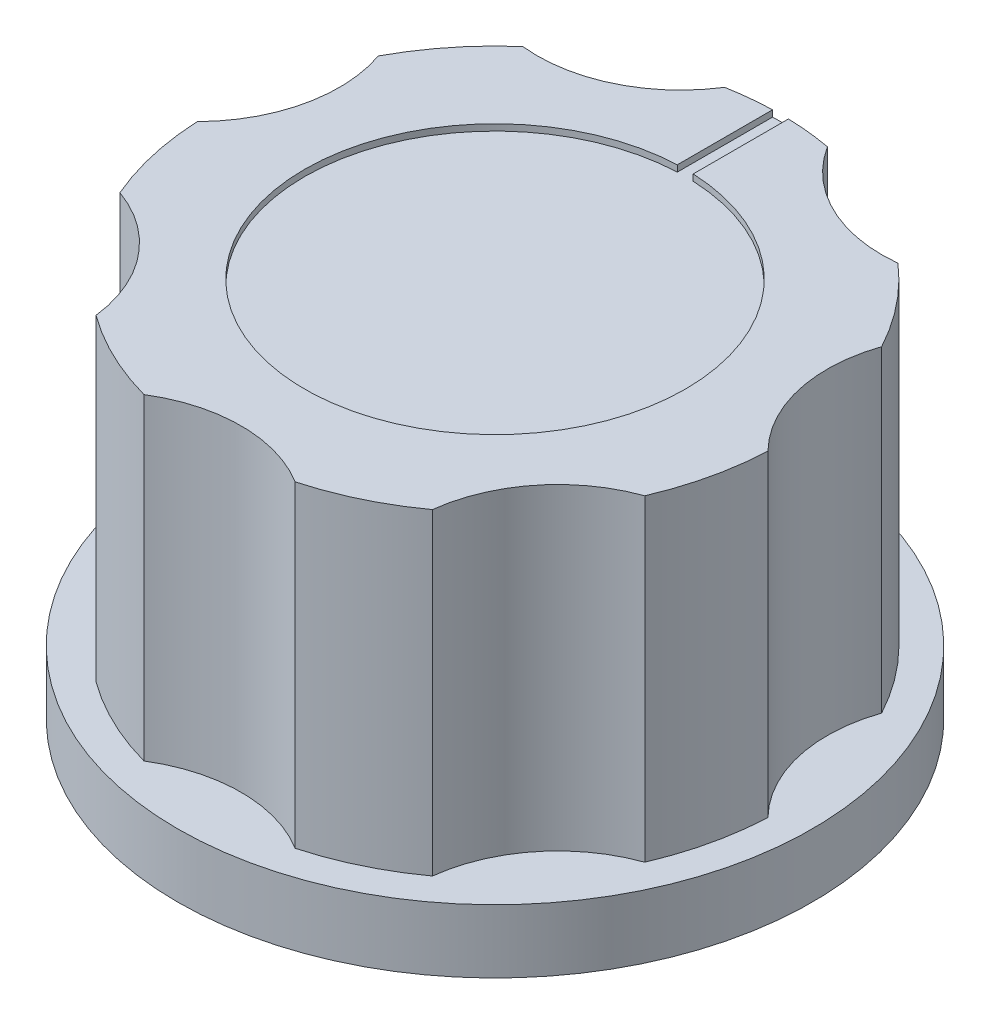
ISO-10303-21;
HEADER;
FILE_DESCRIPTION(('STEP AP214'),'2;1');
FILE_NAME('part.step','',(''),(''),'','','');
FILE_SCHEMA(('AUTOMOTIVE_DESIGN { 1 0 10303 214 1 1 1 1 }'));
ENDSEC;
DATA;
#1=APPLICATION_CONTEXT('core data for automotive mechanical design processes');
#2=APPLICATION_PROTOCOL_DEFINITION('international standard','automotive_design',2000,#1);
#3=PRODUCT_CONTEXT('',#1,'mechanical');
#4=PRODUCT('Part','Part','',(#3));
#5=PRODUCT_RELATED_PRODUCT_CATEGORY('part','',(#4));
#6=PRODUCT_DEFINITION_FORMATION('','',#4);
#7=PRODUCT_DEFINITION_CONTEXT('part definition',#1,'design');
#8=PRODUCT_DEFINITION('design','',#6,#7);
#9=PRODUCT_DEFINITION_SHAPE('','',#8);
#10=(LENGTH_UNIT() NAMED_UNIT(*) SI_UNIT(.MILLI.,.METRE.));
#11=(NAMED_UNIT(*) PLANE_ANGLE_UNIT() SI_UNIT($,.RADIAN.));
#12=(NAMED_UNIT(*) SI_UNIT($,.STERADIAN.) SOLID_ANGLE_UNIT());
#13=UNCERTAINTY_MEASURE_WITH_UNIT(LENGTH_MEASURE(1.E-05),#10,'distance_accuracy_value','');
#14=(GEOMETRIC_REPRESENTATION_CONTEXT(3) GLOBAL_UNCERTAINTY_ASSIGNED_CONTEXT((#13)) GLOBAL_UNIT_ASSIGNED_CONTEXT((#10,
#11,#12)) REPRESENTATION_CONTEXT('',''));
#15=CARTESIAN_POINT('',(0.,0.,0.));
#16=DIRECTION('',(0.,0.,1.));
#17=DIRECTION('',(1.,0.,0.));
#18=AXIS2_PLACEMENT_3D('',#15,#16,#17);
#19=CARTESIAN_POINT('',(0.,11.8,0.));
#20=DIRECTION('',(0.,1.,0.));
#21=DIRECTION('',(0.,0.,1.));
#22=AXIS2_PLACEMENT_3D('',#19,#20,#21);
#23=PLANE('',#22);
#24=CARTESIAN_POINT('',(0.,11.8,0.));
#25=DIRECTION('',(0.,-1.,0.));
#26=DIRECTION('',(0.,0.,-1.));
#27=AXIS2_PLACEMENT_3D('',#24,#25,#26);
#28=CIRCLE('',#27,9.);
#29=CARTESIAN_POINT('',(0.249999999999999,11.8,-8.99652710772329));
#30=VERTEX_POINT('',#29);
#31=CARTESIAN_POINT('',(-0.25,11.8,-8.99652710772329));
#32=VERTEX_POINT('',#31);
#33=EDGE_CURVE('E18',#30,#32,#28,.F.);
#34=ORIENTED_EDGE('',*,*,#33,.T.);
#35=DIRECTION('',(0.,0.,-1.));
#36=VECTOR('',#35,1.);
#37=CARTESIAN_POINT('',(-0.250000000000001,11.8,-5.));
#38=LINE('',#37,#36);
#39=CARTESIAN_POINT('',(-0.250000000000001,11.8,-5.9947894041409));
#40=VERTEX_POINT('',#39);
#41=EDGE_CURVE('E157',#40,#32,#38,.T.);
#42=ORIENTED_EDGE('',*,*,#41,.F.);
#43=CARTESIAN_POINT('',(0.,11.8,0.));
#44=DIRECTION('',(0.,1.,0.));
#45=DIRECTION('',(0.,0.,1.));
#46=AXIS2_PLACEMENT_3D('',#43,#44,#45);
#47=CIRCLE('',#46,6.);
#48=CARTESIAN_POINT('',(0.25,11.8,-5.9947894041409));
#49=VERTEX_POINT('',#48);
#50=EDGE_CURVE('E152',#40,#49,#47,.T.);
#51=ORIENTED_EDGE('',*,*,#50,.T.);
#52=DIRECTION('',(0.,0.,-1.));
#53=VECTOR('',#52,1.);
#54=CARTESIAN_POINT('',(0.249999999999999,11.8,-5.));
#55=LINE('',#54,#53);
#56=EDGE_CURVE('E151',#49,#30,#55,.T.);
#57=ORIENTED_EDGE('',*,*,#56,.T.);
#58=EDGE_LOOP('',(#34,#42,#51,#57));
#59=FACE_BOUND('',#58,.T.);
#60=ADVANCED_FACE('F15',(#59),#23,.T.);
#61=CARTESIAN_POINT('',(-0.250000000000001,6.77506218943955,-5.));
#62=DIRECTION('',(1.,0.,0.));
#63=DIRECTION('',(0.,0.,-1.));
#64=AXIS2_PLACEMENT_3D('',#61,#62,#63);
#65=PLANE('',#64);
#66=DIRECTION('',(0.,1.,0.));
#67=VECTOR('',#66,1.);
#68=CARTESIAN_POINT('',(-0.250000000000001,6.77506218943955,-5.9947894041409));
#69=LINE('',#68,#67);
#70=CARTESIAN_POINT('',(-0.250000000000001,12.,-5.9947894041409));
#71=VERTEX_POINT('',#70);
#72=EDGE_CURVE('E149',#71,#40,#69,.F.);
#73=ORIENTED_EDGE('',*,*,#72,.T.);
#74=ORIENTED_EDGE('',*,*,#41,.T.);
#75=DIRECTION('',(0.,-1.,0.));
#76=VECTOR('',#75,1.);
#77=CARTESIAN_POINT('',(-0.25,12.,-8.99652710772329));
#78=LINE('',#77,#76);
#79=CARTESIAN_POINT('',(-0.25,12.,-8.99652710772329));
#80=VERTEX_POINT('',#79);
#81=EDGE_CURVE('E148',#80,#32,#78,.T.);
#82=ORIENTED_EDGE('',*,*,#81,.F.);
#83=DIRECTION('',(0.,0.,1.));
#84=VECTOR('',#83,1.);
#85=CARTESIAN_POINT('',(-0.250000000000001,12.,0.));
#86=LINE('',#85,#84);
#87=EDGE_CURVE('E164',#71,#80,#86,.F.);
#88=ORIENTED_EDGE('',*,*,#87,.F.);
#89=EDGE_LOOP('',(#73,#74,#82,#88));
#90=FACE_BOUND('',#89,.T.);
#91=ADVANCED_FACE('F414',(#90),#65,.T.);
#92=CARTESIAN_POINT('',(0.249999999999999,6.77506218943955,-5.));
#93=DIRECTION('',(1.,0.,0.));
#94=DIRECTION('',(0.,0.,-1.));
#95=AXIS2_PLACEMENT_3D('',#92,#93,#94);
#96=PLANE('',#95);
#97=DIRECTION('',(0.,1.,0.));
#98=VECTOR('',#97,1.);
#99=CARTESIAN_POINT('',(0.25,11.8,-5.9947894041409));
#100=LINE('',#99,#98);
#101=CARTESIAN_POINT('',(0.25,12.,-5.9947894041409));
#102=VERTEX_POINT('',#101);
#103=EDGE_CURVE('E156',#49,#102,#100,.T.);
#104=ORIENTED_EDGE('',*,*,#103,.T.);
#105=DIRECTION('',(0.,0.,1.));
#106=VECTOR('',#105,1.);
#107=CARTESIAN_POINT('',(0.249999999999999,12.,0.));
#108=LINE('',#107,#106);
#109=CARTESIAN_POINT('',(0.249999999999999,12.,-8.99652710772329));
#110=VERTEX_POINT('',#109);
#111=EDGE_CURVE('E161',#110,#102,#108,.T.);
#112=ORIENTED_EDGE('',*,*,#111,.F.);
#113=DIRECTION('',(0.,-1.,0.));
#114=VECTOR('',#113,1.);
#115=CARTESIAN_POINT('',(0.249999999999999,12.,-8.99652710772329));
#116=LINE('',#115,#114);
#117=EDGE_CURVE('E144',#30,#110,#116,.F.);
#118=ORIENTED_EDGE('',*,*,#117,.F.);
#119=ORIENTED_EDGE('',*,*,#56,.F.);
#120=EDGE_LOOP('',(#104,#112,#118,#119));
#121=FACE_BOUND('',#120,.T.);
#122=ADVANCED_FACE('F160',(#121),#96,.F.);
#123=CARTESIAN_POINT('',(0.,11.8,0.));
#124=DIRECTION('',(0.,1.,0.));
#125=DIRECTION('',(0.,0.,1.));
#126=AXIS2_PLACEMENT_3D('',#123,#124,#125);
#127=CYLINDRICAL_SURFACE('',#126,6.);
#128=ORIENTED_EDGE('',*,*,#50,.F.);
#129=ORIENTED_EDGE('',*,*,#72,.F.);
#130=CARTESIAN_POINT('',(0.,12.,0.));
#131=DIRECTION('',(0.,1.,0.));
#132=DIRECTION('',(0.,0.,1.));
#133=AXIS2_PLACEMENT_3D('',#130,#131,#132);
#134=CIRCLE('',#133,6.);
#135=EDGE_CURVE('E260',#102,#71,#134,.F.);
#136=ORIENTED_EDGE('',*,*,#135,.F.);
#137=ORIENTED_EDGE('',*,*,#103,.F.);
#138=EDGE_LOOP('',(#128,#129,#136,#137));
#139=FACE_BOUND('',#138,.T.);
#140=ADVANCED_FACE('F268',(#139),#127,.F.);
#141=CARTESIAN_POINT('',(0.,11.,0.));
#142=DIRECTION('',(0.,-1.,0.));
#143=DIRECTION('',(0.,0.,-1.));
#144=AXIS2_PLACEMENT_3D('',#141,#142,#143);
#145=PLANE('',#144);
#146=CARTESIAN_POINT('',(0.,11.,0.));
#147=DIRECTION('',(0.,-1.,0.));
#148=DIRECTION('',(0.,0.,-1.));
#149=AXIS2_PLACEMENT_3D('',#146,#147,#148);
#150=CIRCLE('',#149,3.5);
#151=CARTESIAN_POINT('',(0.,11.,-3.5));
#152=VERTEX_POINT('',#151);
#153=EDGE_CURVE('E257',#152,#152,#150,.T.);
#154=ORIENTED_EDGE('',*,*,#153,.T.);
#155=EDGE_LOOP('',(#154));
#156=FACE_BOUND('',#155,.T.);
#157=ADVANCED_FACE('F402',(#156),#145,.T.);
#158=CARTESIAN_POINT('',(0.,12.,0.));
#159=DIRECTION('',(0.,-1.,0.));
#160=DIRECTION('',(0.,0.,-1.));
#161=AXIS2_PLACEMENT_3D('',#158,#159,#160);
#162=CYLINDRICAL_SURFACE('',#161,9.);
#163=DIRECTION('',(0.,-1.,0.));
#164=VECTOR('',#163,1.);
#165=CARTESIAN_POINT('',(1.6221993050285,12.,-8.85259676110716));
#166=LINE('',#165,#164);
#167=CARTESIAN_POINT('',(1.6221993050285,12.,-8.85259676110716));
#168=VERTEX_POINT('',#167);
#169=CARTESIAN_POINT('',(1.6221993050285,2.,-8.85259676110716));
#170=VERTEX_POINT('',#169);
#171=EDGE_CURVE('E232',#168,#170,#166,.T.);
#172=ORIENTED_EDGE('',*,*,#171,.T.);
#173=CARTESIAN_POINT('',(0.,2.,0.));
#174=DIRECTION('',(0.,-1.,0.));
#175=DIRECTION('',(0.,0.,-1.));
#176=AXIS2_PLACEMENT_3D('',#173,#174,#175);
#177=CIRCLE('',#176,9.);
#178=CARTESIAN_POINT('',(-1.61852102637475,2.,-8.85326999967711));
#179=VERTEX_POINT('',#178);
#180=EDGE_CURVE('E162',#170,#179,#177,.F.);
#181=ORIENTED_EDGE('',*,*,#180,.T.);
#182=DIRECTION('',(0.,-1.,0.));
#183=VECTOR('',#182,1.);
#184=CARTESIAN_POINT('',(-1.61852102637475,12.,-8.85326999967711));
#185=LINE('',#184,#183);
#186=CARTESIAN_POINT('',(-1.61852102637475,12.,-8.85326999967711));
#187=VERTEX_POINT('',#186);
#188=EDGE_CURVE('E237',#179,#187,#185,.F.);
#189=ORIENTED_EDGE('',*,*,#188,.T.);
#190=CARTESIAN_POINT('',(0.,12.,0.));
#191=DIRECTION('',(0.,-1.,0.));
#192=DIRECTION('',(0.,0.,-1.));
#193=AXIS2_PLACEMENT_3D('',#190,#191,#192);
#194=CIRCLE('',#193,9.);
#195=EDGE_CURVE('E264',#80,#187,#194,.F.);
#196=ORIENTED_EDGE('',*,*,#195,.F.);
#197=ORIENTED_EDGE('',*,*,#81,.T.);
#198=ORIENTED_EDGE('',*,*,#33,.F.);
#199=ORIENTED_EDGE('',*,*,#117,.T.);
#200=CARTESIAN_POINT('',(0.,12.,0.));
#201=DIRECTION('',(0.,-1.,0.));
#202=DIRECTION('',(0.,0.,-1.));
#203=AXIS2_PLACEMENT_3D('',#200,#201,#202);
#204=CIRCLE('',#203,9.);
#205=EDGE_CURVE('E262',#168,#110,#204,.F.);
#206=ORIENTED_EDGE('',*,*,#205,.F.);
#207=EDGE_LOOP('',(#172,#181,#189,#196,#197,#198,#199,#206));
#208=FACE_BOUND('',#207,.T.);
#209=ADVANCED_FACE('F142',(#208),#162,.T.);
#210=CARTESIAN_POINT('',(0.,12.,0.));
#211=DIRECTION('',(0.,1.,0.));
#212=DIRECTION('',(0.,0.,1.));
#213=AXIS2_PLACEMENT_3D('',#210,#211,#212);
#214=PLANE('',#213);
#215=ORIENTED_EDGE('',*,*,#111,.T.);
#216=ORIENTED_EDGE('',*,*,#135,.T.);
#217=ORIENTED_EDGE('',*,*,#87,.T.);
#218=ORIENTED_EDGE('',*,*,#195,.T.);
#219=CARTESIAN_POINT('',(-5.42751087701987,12.,-11.2747237525284));
#220=DIRECTION('',(0.,-1.,0.));
#221=DIRECTION('',(0.,0.,-1.));
#222=AXIS2_PLACEMENT_3D('',#219,#220,#221);
#223=CIRCLE('',#222,4.51351769238971);
#224=CARTESIAN_POINT('',(-5.91057194608461,12.,-6.78713041499555));
#225=VERTEX_POINT('',#224);
#226=EDGE_CURVE('E234',#187,#225,#223,.T.);
#227=ORIENTED_EDGE('',*,*,#226,.T.);
#228=CARTESIAN_POINT('',(0.,12.,0.));
#229=DIRECTION('',(0.,-1.,0.));
#230=DIRECTION('',(0.,0.,-1.));
#231=AXIS2_PLACEMENT_3D('',#228,#229,#230);
#232=CIRCLE('',#231,9.);
#233=CARTESIAN_POINT('',(-7.93083109619143,12.,-4.25463489898757));
#234=VERTEX_POINT('',#233);
#235=EDGE_CURVE('E238',#234,#225,#232,.T.);
#236=ORIENTED_EDGE('',*,*,#235,.F.);
#237=CARTESIAN_POINT('',(-12.1985551569579,12.,-2.7854945719016));
#238=DIRECTION('',(0.,-1.,0.));
#239=DIRECTION('',(0.,0.,-1.));
#240=AXIS2_PLACEMENT_3D('',#237,#238,#239);
#241=CIRCLE('',#240,4.51351769238971);
#242=CARTESIAN_POINT('',(-8.99152528670805,12.,0.390477935983253));
#243=VERTEX_POINT('',#242);
#244=EDGE_CURVE('E241',#234,#243,#241,.T.);
#245=ORIENTED_EDGE('',*,*,#244,.T.);
#246=CARTESIAN_POINT('',(0.,12.,0.));
#247=DIRECTION('',(0.,-1.,0.));
#248=DIRECTION('',(0.,0.,-1.));
#249=AXIS2_PLACEMENT_3D('',#246,#247,#248);
#250=CIRCLE('',#249,9.);
#251=CARTESIAN_POINT('',(-8.27087181721517,12.,3.5486165449645));
#252=VERTEX_POINT('',#251);
#253=EDGE_CURVE('E245',#252,#243,#250,.T.);
#254=ORIENTED_EDGE('',*,*,#253,.F.);
#255=CARTESIAN_POINT('',(-9.78308557813283,12.,7.80126883510135));
#256=DIRECTION('',(0.,-1.,0.));
#257=DIRECTION('',(0.,0.,-1.));
#258=AXIS2_PLACEMENT_3D('',#255,#256,#257);
#259=CIRCLE('',#258,4.51351769238971);
#260=CARTESIAN_POINT('',(-5.30052517444999,12.,7.27354335073504));
#261=VERTEX_POINT('',#260);
#262=EDGE_CURVE('E248',#252,#261,#259,.T.);
#263=ORIENTED_EDGE('',*,*,#262,.T.);
#264=CARTESIAN_POINT('',(0.,12.,0.));
#265=DIRECTION('',(0.,-1.,0.));
#266=DIRECTION('',(0.,0.,-1.));
#267=AXIS2_PLACEMENT_3D('',#264,#265,#266);
#268=CIRCLE('',#267,9.);
#269=CARTESIAN_POINT('',(-2.38125,12.,8.67926543190724));
#270=VERTEX_POINT('',#269);
#271=EDGE_CURVE('E252',#270,#261,#268,.T.);
#272=ORIENTED_EDGE('',*,*,#271,.F.);
#273=CARTESIAN_POINT('',(0.,12.,12.5135176923897));
#274=DIRECTION('',(0.,-1.,0.));
#275=DIRECTION('',(0.,0.,-1.));
#276=AXIS2_PLACEMENT_3D('',#273,#274,#275);
#277=CIRCLE('',#276,4.51351769238971);
#278=CARTESIAN_POINT('',(2.38125,12.,8.67926543190724));
#279=VERTEX_POINT('',#278);
#280=EDGE_CURVE('E255',#270,#279,#277,.T.);
#281=ORIENTED_EDGE('',*,*,#280,.T.);
#282=CARTESIAN_POINT('',(0.,12.,0.));
#283=DIRECTION('',(0.,-1.,0.));
#284=DIRECTION('',(0.,0.,-1.));
#285=AXIS2_PLACEMENT_3D('',#282,#283,#284);
#286=CIRCLE('',#285,9.);
#287=CARTESIAN_POINT('',(5.30155090057745,12.,7.27279575188156));
#288=VERTEX_POINT('',#287);
#289=EDGE_CURVE('E211',#288,#279,#286,.T.);
#290=ORIENTED_EDGE('',*,*,#289,.F.);
#291=CARTESIAN_POINT('',(9.78383859852912,12.,7.80283249806629));
#292=DIRECTION('',(0.,-1.,0.));
#293=DIRECTION('',(0.,0.,-1.));
#294=AXIS2_PLACEMENT_3D('',#291,#292,#293);
#295=CIRCLE('',#294,4.51351769238971);
#296=CARTESIAN_POINT('',(8.26994399063393,12.,3.55077827972654));
#297=VERTEX_POINT('',#296);
#298=EDGE_CURVE('E215',#288,#297,#295,.T.);
#299=ORIENTED_EDGE('',*,*,#298,.T.);
#300=CARTESIAN_POINT('',(0.,12.,0.));
#301=DIRECTION('',(0.,-1.,0.));
#302=DIRECTION('',(0.,0.,-1.));
#303=AXIS2_PLACEMENT_3D('',#300,#301,#302);
#304=CIRCLE('',#303,9.);
#305=CARTESIAN_POINT('',(8.99154694707646,12.,0.389978843682589));
#306=VERTEX_POINT('',#305);
#307=EDGE_CURVE('E219',#306,#297,#304,.T.);
#308=ORIENTED_EDGE('',*,*,#307,.F.);
#309=CARTESIAN_POINT('',(12.2010001988258,12.,-2.78354471607724));
#310=DIRECTION('',(0.,-1.,0.));
#311=DIRECTION('',(0.,0.,-1.));
#312=AXIS2_PLACEMENT_3D('',#309,#310,#311);
#313=CIRCLE('',#312,4.51351769238971);
#314=CARTESIAN_POINT('',(7.93272911158021,12.,-4.25109501685012));
#315=VERTEX_POINT('',#314);
#316=EDGE_CURVE('E222',#306,#315,#313,.T.);
#317=ORIENTED_EDGE('',*,*,#316,.T.);
#318=CARTESIAN_POINT('',(0.,12.,0.));
#319=DIRECTION('',(0.,-1.,0.));
#320=DIRECTION('',(0.,0.,-1.));
#321=AXIS2_PLACEMENT_3D('',#318,#319,#320);
#322=CIRCLE('',#321,9.);
#323=CARTESIAN_POINT('',(5.91187609212745,12.,-6.78599447917045));
#324=VERTEX_POINT('',#323);
#325=EDGE_CURVE('E226',#324,#315,#322,.T.);
#326=ORIENTED_EDGE('',*,*,#325,.F.);
#327=CARTESIAN_POINT('',(5.43131281475566,12.,-11.2738559850501));
#328=DIRECTION('',(0.,-1.,0.));
#329=DIRECTION('',(0.,0.,-1.));
#330=AXIS2_PLACEMENT_3D('',#327,#328,#329);
#331=CIRCLE('',#330,4.51351769238971);
#332=EDGE_CURVE('E229',#324,#168,#331,.T.);
#333=ORIENTED_EDGE('',*,*,#332,.T.);
#334=ORIENTED_EDGE('',*,*,#205,.T.);
#335=EDGE_LOOP('',(#215,#216,#217,#218,#227,#236,#245,#254,#263,#272,#281,#290,#299,#308,#317,
#326,#333,#334));
#336=FACE_BOUND('',#335,.T.);
#337=ADVANCED_FACE('F271',(#336),#214,.T.);
#338=CARTESIAN_POINT('',(0.,11.,0.));
#339=DIRECTION('',(0.,-1.,0.));
#340=DIRECTION('',(0.,0.,-1.));
#341=AXIS2_PLACEMENT_3D('',#338,#339,#340);
#342=CYLINDRICAL_SURFACE('',#341,3.5);
#343=CARTESIAN_POINT('',(0.,2.,0.));
#344=DIRECTION('',(0.,-1.,0.));
#345=DIRECTION('',(0.,0.,-1.));
#346=AXIS2_PLACEMENT_3D('',#343,#344,#345);
#347=CIRCLE('',#346,3.5);
#348=CARTESIAN_POINT('',(0.,2.,-3.5));
#349=VERTEX_POINT('',#348);
#350=EDGE_CURVE('E207',#349,#349,#347,.F.);
#351=ORIENTED_EDGE('',*,*,#350,.F.);
#352=EDGE_LOOP('',(#351));
#353=FACE_BOUND('',#352,.T.);
#354=ORIENTED_EDGE('',*,*,#153,.F.);
#355=EDGE_LOOP('',(#354));
#356=FACE_BOUND('',#355,.T.);
#357=ADVANCED_FACE('F396',(#353,#356),#342,.F.);
#358=CARTESIAN_POINT('',(0.,12.,12.5135176923897));
#359=DIRECTION('',(0.,-1.,0.));
#360=DIRECTION('',(0.,0.,-1.));
#361=AXIS2_PLACEMENT_3D('',#358,#359,#360);
#362=CYLINDRICAL_SURFACE('',#361,4.51351769238971);
#363=ORIENTED_EDGE('',*,*,#280,.F.);
#364=DIRECTION('',(0.,-1.,0.));
#365=VECTOR('',#364,1.);
#366=CARTESIAN_POINT('',(-2.38125,12.,8.67926543190724));
#367=LINE('',#366,#365);
#368=CARTESIAN_POINT('',(-2.38125,2.,8.67926543190724));
#369=VERTEX_POINT('',#368);
#370=EDGE_CURVE('E254',#369,#270,#367,.F.);
#371=ORIENTED_EDGE('',*,*,#370,.F.);
#372=CARTESIAN_POINT('',(0.,2.,12.5135176923897));
#373=DIRECTION('',(0.,-1.,0.));
#374=DIRECTION('',(0.,0.,-1.));
#375=AXIS2_PLACEMENT_3D('',#372,#373,#374);
#376=CIRCLE('',#375,4.51351769238971);
#377=CARTESIAN_POINT('',(2.38125,2.,8.67926543190724));
#378=VERTEX_POINT('',#377);
#379=EDGE_CURVE('E205',#378,#369,#376,.F.);
#380=ORIENTED_EDGE('',*,*,#379,.F.);
#381=DIRECTION('',(0.,-1.,0.));
#382=VECTOR('',#381,1.);
#383=CARTESIAN_POINT('',(2.38125,12.,8.67926543190724));
#384=LINE('',#383,#382);
#385=EDGE_CURVE('E210',#279,#378,#384,.T.);
#386=ORIENTED_EDGE('',*,*,#385,.F.);
#387=EDGE_LOOP('',(#363,#371,#380,#386));
#388=FACE_BOUND('',#387,.T.);
#389=ADVANCED_FACE('F309',(#388),#362,.F.);
#390=CARTESIAN_POINT('',(0.,12.,0.));
#391=DIRECTION('',(0.,-1.,0.));
#392=DIRECTION('',(0.,0.,-1.));
#393=AXIS2_PLACEMENT_3D('',#390,#391,#392);
#394=CYLINDRICAL_SURFACE('',#393,9.);
#395=ORIENTED_EDGE('',*,*,#271,.T.);
#396=DIRECTION('',(0.,-1.,0.));
#397=VECTOR('',#396,1.);
#398=CARTESIAN_POINT('',(-5.30052517444999,12.,7.27354335073504));
#399=LINE('',#398,#397);
#400=CARTESIAN_POINT('',(-5.30052517444999,2.,7.27354335073504));
#401=VERTEX_POINT('',#400);
#402=EDGE_CURVE('E251',#261,#401,#399,.T.);
#403=ORIENTED_EDGE('',*,*,#402,.T.);
#404=CARTESIAN_POINT('',(0.,2.,0.));
#405=DIRECTION('',(0.,-1.,0.));
#406=DIRECTION('',(0.,0.,-1.));
#407=AXIS2_PLACEMENT_3D('',#404,#405,#406);
#408=CIRCLE('',#407,9.);
#409=EDGE_CURVE('E203',#369,#401,#408,.T.);
#410=ORIENTED_EDGE('',*,*,#409,.F.);
#411=ORIENTED_EDGE('',*,*,#370,.T.);
#412=EDGE_LOOP('',(#395,#403,#410,#411));
#413=FACE_BOUND('',#412,.T.);
#414=ADVANCED_FACE('F312',(#413),#394,.T.);
#415=CARTESIAN_POINT('',(-9.78308557813283,12.,7.80126883510135));
#416=DIRECTION('',(0.,-1.,0.));
#417=DIRECTION('',(0.,0.,-1.));
#418=AXIS2_PLACEMENT_3D('',#415,#416,#417);
#419=CYLINDRICAL_SURFACE('',#418,4.51351769238971);
#420=ORIENTED_EDGE('',*,*,#402,.F.);
#421=ORIENTED_EDGE('',*,*,#262,.F.);
#422=DIRECTION('',(0.,-1.,0.));
#423=VECTOR('',#422,1.);
#424=CARTESIAN_POINT('',(-8.27087181721517,12.,3.5486165449645));
#425=LINE('',#424,#423);
#426=CARTESIAN_POINT('',(-8.27087181721517,2.,3.5486165449645));
#427=VERTEX_POINT('',#426);
#428=EDGE_CURVE('E247',#427,#252,#425,.F.);
#429=ORIENTED_EDGE('',*,*,#428,.F.);
#430=CARTESIAN_POINT('',(-9.78308557813283,2.,7.80126883510135));
#431=DIRECTION('',(0.,-1.,0.));
#432=DIRECTION('',(0.,0.,-1.));
#433=AXIS2_PLACEMENT_3D('',#430,#431,#432);
#434=CIRCLE('',#433,4.51351769238971);
#435=EDGE_CURVE('E201',#401,#427,#434,.F.);
#436=ORIENTED_EDGE('',*,*,#435,.F.);
#437=EDGE_LOOP('',(#420,#421,#429,#436));
#438=FACE_BOUND('',#437,.T.);
#439=ADVANCED_FACE('F317',(#438),#419,.F.);
#440=CARTESIAN_POINT('',(0.,12.,0.));
#441=DIRECTION('',(0.,-1.,0.));
#442=DIRECTION('',(0.,0.,-1.));
#443=AXIS2_PLACEMENT_3D('',#440,#441,#442);
#444=CYLINDRICAL_SURFACE('',#443,9.);
#445=ORIENTED_EDGE('',*,*,#253,.T.);
#446=DIRECTION('',(0.,-1.,0.));
#447=VECTOR('',#446,1.);
#448=CARTESIAN_POINT('',(-8.99152528670805,12.,0.390477935983254));
#449=LINE('',#448,#447);
#450=CARTESIAN_POINT('',(-8.99152528670805,2.,0.390477935983253));
#451=VERTEX_POINT('',#450);
#452=EDGE_CURVE('E244',#243,#451,#449,.T.);
#453=ORIENTED_EDGE('',*,*,#452,.T.);
#454=CARTESIAN_POINT('',(0.,2.,0.));
#455=DIRECTION('',(0.,-1.,0.));
#456=DIRECTION('',(0.,0.,-1.));
#457=AXIS2_PLACEMENT_3D('',#454,#455,#456);
#458=CIRCLE('',#457,9.);
#459=EDGE_CURVE('E199',#427,#451,#458,.T.);
#460=ORIENTED_EDGE('',*,*,#459,.F.);
#461=ORIENTED_EDGE('',*,*,#428,.T.);
#462=EDGE_LOOP('',(#445,#453,#460,#461));
#463=FACE_BOUND('',#462,.T.);
#464=ADVANCED_FACE('F323',(#463),#444,.T.);
#465=CARTESIAN_POINT('',(-12.1985551569579,12.,-2.7854945719016));
#466=DIRECTION('',(0.,-1.,0.));
#467=DIRECTION('',(0.,0.,-1.));
#468=AXIS2_PLACEMENT_3D('',#465,#466,#467);
#469=CYLINDRICAL_SURFACE('',#468,4.51351769238971);
#470=ORIENTED_EDGE('',*,*,#452,.F.);
#471=ORIENTED_EDGE('',*,*,#244,.F.);
#472=DIRECTION('',(0.,-1.,0.));
#473=VECTOR('',#472,1.);
#474=CARTESIAN_POINT('',(-7.93083109619143,12.,-4.25463489898757));
#475=LINE('',#474,#473);
#476=CARTESIAN_POINT('',(-7.93083109619143,2.,-4.25463489898757));
#477=VERTEX_POINT('',#476);
#478=EDGE_CURVE('E240',#477,#234,#475,.F.);
#479=ORIENTED_EDGE('',*,*,#478,.F.);
#480=CARTESIAN_POINT('',(-12.1985551569579,2.,-2.7854945719016));
#481=DIRECTION('',(0.,-1.,0.));
#482=DIRECTION('',(0.,0.,-1.));
#483=AXIS2_PLACEMENT_3D('',#480,#481,#482);
#484=CIRCLE('',#483,4.51351769238971);
#485=EDGE_CURVE('E197',#451,#477,#484,.F.);
#486=ORIENTED_EDGE('',*,*,#485,.F.);
#487=EDGE_LOOP('',(#470,#471,#479,#486));
#488=FACE_BOUND('',#487,.T.);
#489=ADVANCED_FACE('F326',(#488),#469,.F.);
#490=CARTESIAN_POINT('',(0.,12.,0.));
#491=DIRECTION('',(0.,-1.,0.));
#492=DIRECTION('',(0.,0.,-1.));
#493=AXIS2_PLACEMENT_3D('',#490,#491,#492);
#494=CYLINDRICAL_SURFACE('',#493,9.);
#495=ORIENTED_EDGE('',*,*,#235,.T.);
#496=DIRECTION('',(0.,-1.,0.));
#497=VECTOR('',#496,1.);
#498=CARTESIAN_POINT('',(-5.91057194608461,12.,-6.78713041499555));
#499=LINE('',#498,#497);
#500=CARTESIAN_POINT('',(-5.91057194608461,2.,-6.78713041499555));
#501=VERTEX_POINT('',#500);
#502=EDGE_CURVE('E233',#225,#501,#499,.T.);
#503=ORIENTED_EDGE('',*,*,#502,.T.);
#504=CARTESIAN_POINT('',(0.,2.,0.));
#505=DIRECTION('',(0.,-1.,0.));
#506=DIRECTION('',(0.,0.,-1.));
#507=AXIS2_PLACEMENT_3D('',#504,#505,#506);
#508=CIRCLE('',#507,9.);
#509=EDGE_CURVE('E195',#477,#501,#508,.T.);
#510=ORIENTED_EDGE('',*,*,#509,.F.);
#511=ORIENTED_EDGE('',*,*,#478,.T.);
#512=EDGE_LOOP('',(#495,#503,#510,#511));
#513=FACE_BOUND('',#512,.T.);
#514=ADVANCED_FACE('F330',(#513),#494,.T.);
#515=CARTESIAN_POINT('',(-5.42751087701987,12.,-11.2747237525284));
#516=DIRECTION('',(0.,-1.,0.));
#517=DIRECTION('',(0.,0.,-1.));
#518=AXIS2_PLACEMENT_3D('',#515,#516,#517);
#519=CYLINDRICAL_SURFACE('',#518,4.51351769238971);
#520=ORIENTED_EDGE('',*,*,#502,.F.);
#521=ORIENTED_EDGE('',*,*,#226,.F.);
#522=ORIENTED_EDGE('',*,*,#188,.F.);
#523=CARTESIAN_POINT('',(-5.42751087701987,2.,-11.2747237525284));
#524=DIRECTION('',(0.,-1.,0.));
#525=DIRECTION('',(0.,0.,-1.));
#526=AXIS2_PLACEMENT_3D('',#523,#524,#525);
#527=CIRCLE('',#526,4.51351769238971);
#528=EDGE_CURVE('E192',#501,#179,#527,.F.);
#529=ORIENTED_EDGE('',*,*,#528,.F.);
#530=EDGE_LOOP('',(#520,#521,#522,#529));
#531=FACE_BOUND('',#530,.T.);
#532=ADVANCED_FACE('F335',(#531),#519,.F.);
#533=CARTESIAN_POINT('',(5.43131281475566,12.,-11.2738559850501));
#534=DIRECTION('',(0.,-1.,0.));
#535=DIRECTION('',(0.,0.,-1.));
#536=AXIS2_PLACEMENT_3D('',#533,#534,#535);
#537=CYLINDRICAL_SURFACE('',#536,4.51351769238971);
#538=ORIENTED_EDGE('',*,*,#171,.F.);
#539=ORIENTED_EDGE('',*,*,#332,.F.);
#540=DIRECTION('',(0.,-1.,0.));
#541=VECTOR('',#540,1.);
#542=CARTESIAN_POINT('',(5.91187609212745,12.,-6.78599447917045));
#543=LINE('',#542,#541);
#544=CARTESIAN_POINT('',(5.91187609212745,2.,-6.78599447917045));
#545=VERTEX_POINT('',#544);
#546=EDGE_CURVE('E228',#545,#324,#543,.F.);
#547=ORIENTED_EDGE('',*,*,#546,.F.);
#548=CARTESIAN_POINT('',(5.43131281475566,2.,-11.2738559850501));
#549=DIRECTION('',(0.,-1.,0.));
#550=DIRECTION('',(0.,0.,-1.));
#551=AXIS2_PLACEMENT_3D('',#548,#549,#550);
#552=CIRCLE('',#551,4.51351769238971);
#553=EDGE_CURVE('E190',#170,#545,#552,.F.);
#554=ORIENTED_EDGE('',*,*,#553,.F.);
#555=EDGE_LOOP('',(#538,#539,#547,#554));
#556=FACE_BOUND('',#555,.T.);
#557=ADVANCED_FACE('F341',(#556),#537,.F.);
#558=CARTESIAN_POINT('',(0.,12.,0.));
#559=DIRECTION('',(0.,-1.,0.));
#560=DIRECTION('',(0.,0.,-1.));
#561=AXIS2_PLACEMENT_3D('',#558,#559,#560);
#562=CYLINDRICAL_SURFACE('',#561,9.);
#563=ORIENTED_EDGE('',*,*,#325,.T.);
#564=DIRECTION('',(0.,-1.,0.));
#565=VECTOR('',#564,1.);
#566=CARTESIAN_POINT('',(7.93272911158021,12.,-4.25109501685012));
#567=LINE('',#566,#565);
#568=CARTESIAN_POINT('',(7.93272911158021,2.,-4.25109501685012));
#569=VERTEX_POINT('',#568);
#570=EDGE_CURVE('E225',#315,#569,#567,.T.);
#571=ORIENTED_EDGE('',*,*,#570,.T.);
#572=CARTESIAN_POINT('',(0.,2.,0.));
#573=DIRECTION('',(0.,-1.,0.));
#574=DIRECTION('',(0.,0.,-1.));
#575=AXIS2_PLACEMENT_3D('',#572,#573,#574);
#576=CIRCLE('',#575,9.);
#577=EDGE_CURVE('E188',#545,#569,#576,.T.);
#578=ORIENTED_EDGE('',*,*,#577,.F.);
#579=ORIENTED_EDGE('',*,*,#546,.T.);
#580=EDGE_LOOP('',(#563,#571,#578,#579));
#581=FACE_BOUND('',#580,.T.);
#582=ADVANCED_FACE('F347',(#581),#562,.T.);
#583=CARTESIAN_POINT('',(12.2010001988258,12.,-2.78354471607724));
#584=DIRECTION('',(0.,-1.,0.));
#585=DIRECTION('',(0.,0.,-1.));
#586=AXIS2_PLACEMENT_3D('',#583,#584,#585);
#587=CYLINDRICAL_SURFACE('',#586,4.51351769238971);
#588=ORIENTED_EDGE('',*,*,#570,.F.);
#589=ORIENTED_EDGE('',*,*,#316,.F.);
#590=DIRECTION('',(0.,-1.,0.));
#591=VECTOR('',#590,1.);
#592=CARTESIAN_POINT('',(8.99154694707646,12.,0.389978843682589));
#593=LINE('',#592,#591);
#594=CARTESIAN_POINT('',(8.99154694707646,2.,0.389978843682589));
#595=VERTEX_POINT('',#594);
#596=EDGE_CURVE('E221',#595,#306,#593,.F.);
#597=ORIENTED_EDGE('',*,*,#596,.F.);
#598=CARTESIAN_POINT('',(12.2010001988258,2.,-2.78354471607724));
#599=DIRECTION('',(0.,-1.,0.));
#600=DIRECTION('',(0.,0.,-1.));
#601=AXIS2_PLACEMENT_3D('',#598,#599,#600);
#602=CIRCLE('',#601,4.51351769238971);
#603=EDGE_CURVE('E186',#569,#595,#602,.F.);
#604=ORIENTED_EDGE('',*,*,#603,.F.);
#605=EDGE_LOOP('',(#588,#589,#597,#604));
#606=FACE_BOUND('',#605,.T.);
#607=ADVANCED_FACE('F350',(#606),#587,.F.);
#608=CARTESIAN_POINT('',(0.,12.,0.));
#609=DIRECTION('',(0.,-1.,0.));
#610=DIRECTION('',(0.,0.,-1.));
#611=AXIS2_PLACEMENT_3D('',#608,#609,#610);
#612=CYLINDRICAL_SURFACE('',#611,9.);
#613=ORIENTED_EDGE('',*,*,#307,.T.);
#614=DIRECTION('',(0.,-1.,0.));
#615=VECTOR('',#614,1.);
#616=CARTESIAN_POINT('',(8.26994399063393,12.,3.55077827972654));
#617=LINE('',#616,#615);
#618=CARTESIAN_POINT('',(8.26994399063393,2.,3.55077827972654));
#619=VERTEX_POINT('',#618);
#620=EDGE_CURVE('E218',#297,#619,#617,.T.);
#621=ORIENTED_EDGE('',*,*,#620,.T.);
#622=CARTESIAN_POINT('',(0.,2.,0.));
#623=DIRECTION('',(0.,-1.,0.));
#624=DIRECTION('',(0.,0.,-1.));
#625=AXIS2_PLACEMENT_3D('',#622,#623,#624);
#626=CIRCLE('',#625,9.);
#627=EDGE_CURVE('E184',#595,#619,#626,.T.);
#628=ORIENTED_EDGE('',*,*,#627,.F.);
#629=ORIENTED_EDGE('',*,*,#596,.T.);
#630=EDGE_LOOP('',(#613,#621,#628,#629));
#631=FACE_BOUND('',#630,.T.);
#632=ADVANCED_FACE('F354',(#631),#612,.T.);
#633=CARTESIAN_POINT('',(9.78383859852912,12.,7.80283249806629));
#634=DIRECTION('',(0.,-1.,0.));
#635=DIRECTION('',(0.,0.,-1.));
#636=AXIS2_PLACEMENT_3D('',#633,#634,#635);
#637=CYLINDRICAL_SURFACE('',#636,4.51351769238971);
#638=ORIENTED_EDGE('',*,*,#620,.F.);
#639=ORIENTED_EDGE('',*,*,#298,.F.);
#640=DIRECTION('',(0.,-1.,0.));
#641=VECTOR('',#640,1.);
#642=CARTESIAN_POINT('',(5.30155090057745,12.,7.27279575188156));
#643=LINE('',#642,#641);
#644=CARTESIAN_POINT('',(5.30155090057745,2.,7.27279575188156));
#645=VERTEX_POINT('',#644);
#646=EDGE_CURVE('E214',#645,#288,#643,.F.);
#647=ORIENTED_EDGE('',*,*,#646,.F.);
#648=CARTESIAN_POINT('',(9.78383859852912,2.,7.80283249806629));
#649=DIRECTION('',(0.,-1.,0.));
#650=DIRECTION('',(0.,0.,-1.));
#651=AXIS2_PLACEMENT_3D('',#648,#649,#650);
#652=CIRCLE('',#651,4.51351769238971);
#653=EDGE_CURVE('E33',#619,#645,#652,.F.);
#654=ORIENTED_EDGE('',*,*,#653,.F.);
#655=EDGE_LOOP('',(#638,#639,#647,#654));
#656=FACE_BOUND('',#655,.T.);
#657=ADVANCED_FACE('F357',(#656),#637,.F.);
#658=CARTESIAN_POINT('',(0.,12.,0.));
#659=DIRECTION('',(0.,-1.,0.));
#660=DIRECTION('',(0.,0.,-1.));
#661=AXIS2_PLACEMENT_3D('',#658,#659,#660);
#662=CYLINDRICAL_SURFACE('',#661,9.);
#663=ORIENTED_EDGE('',*,*,#289,.T.);
#664=ORIENTED_EDGE('',*,*,#385,.T.);
#665=CARTESIAN_POINT('',(0.,2.,0.));
#666=DIRECTION('',(0.,-1.,0.));
#667=DIRECTION('',(0.,0.,-1.));
#668=AXIS2_PLACEMENT_3D('',#665,#666,#667);
#669=CIRCLE('',#668,9.);
#670=EDGE_CURVE('E181',#645,#378,#669,.T.);
#671=ORIENTED_EDGE('',*,*,#670,.F.);
#672=ORIENTED_EDGE('',*,*,#646,.T.);
#673=EDGE_LOOP('',(#663,#664,#671,#672));
#674=FACE_BOUND('',#673,.T.);
#675=ADVANCED_FACE('F303',(#674),#662,.T.);
#676=CARTESIAN_POINT('',(0.,2.,0.));
#677=DIRECTION('',(0.,-1.,0.));
#678=DIRECTION('',(0.,0.,-1.));
#679=AXIS2_PLACEMENT_3D('',#676,#677,#678);
#680=PLANE('',#679);
#681=CARTESIAN_POINT('',(0.,2.,0.));
#682=DIRECTION('',(0.,-1.,0.));
#683=DIRECTION('',(0.,0.,-1.));
#684=AXIS2_PLACEMENT_3D('',#681,#682,#683);
#685=CIRCLE('',#684,6.5);
#686=CARTESIAN_POINT('',(0.,2.,-6.5));
#687=VERTEX_POINT('',#686);
#688=EDGE_CURVE('E178',#687,#687,#685,.T.);
#689=ORIENTED_EDGE('',*,*,#688,.T.);
#690=EDGE_LOOP('',(#689));
#691=FACE_BOUND('',#690,.T.);
#692=ORIENTED_EDGE('',*,*,#350,.T.);
#693=EDGE_LOOP('',(#692));
#694=FACE_BOUND('',#693,.T.);
#695=ADVANCED_FACE('F365',(#691,#694),#680,.T.);
#696=CARTESIAN_POINT('',(0.,2.,0.));
#697=DIRECTION('',(0.,1.,0.));
#698=DIRECTION('',(0.,0.,1.));
#699=AXIS2_PLACEMENT_3D('',#696,#697,#698);
#700=PLANE('',#699);
#701=CARTESIAN_POINT('',(0.,2.,0.));
#702=DIRECTION('',(0.,-1.,0.));
#703=DIRECTION('',(0.,0.,-1.));
#704=AXIS2_PLACEMENT_3D('',#701,#702,#703);
#705=CIRCLE('',#704,10.);
#706=CARTESIAN_POINT('',(0.,2.,-10.));
#707=VERTEX_POINT('',#706);
#708=EDGE_CURVE('E175',#707,#707,#705,.T.);
#709=ORIENTED_EDGE('',*,*,#708,.F.);
#710=EDGE_LOOP('',(#709));
#711=FACE_BOUND('',#710,.T.);
#712=ORIENTED_EDGE('',*,*,#653,.T.);
#713=ORIENTED_EDGE('',*,*,#670,.T.);
#714=ORIENTED_EDGE('',*,*,#379,.T.);
#715=ORIENTED_EDGE('',*,*,#409,.T.);
#716=ORIENTED_EDGE('',*,*,#435,.T.);
#717=ORIENTED_EDGE('',*,*,#459,.T.);
#718=ORIENTED_EDGE('',*,*,#485,.T.);
#719=ORIENTED_EDGE('',*,*,#509,.T.);
#720=ORIENTED_EDGE('',*,*,#528,.T.);
#721=ORIENTED_EDGE('',*,*,#180,.F.);
#722=ORIENTED_EDGE('',*,*,#553,.T.);
#723=ORIENTED_EDGE('',*,*,#577,.T.);
#724=ORIENTED_EDGE('',*,*,#603,.T.);
#725=ORIENTED_EDGE('',*,*,#627,.T.);
#726=EDGE_LOOP('',(#712,#713,#714,#715,#716,#717,#718,#719,#720,#721,#722,#723,#724,#725));
#727=FACE_BOUND('',#726,.T.);
#728=ADVANCED_FACE('F306',(#711,#727),#700,.T.);
#729=CARTESIAN_POINT('',(0.,2.,0.));
#730=DIRECTION('',(0.,-1.,0.));
#731=DIRECTION('',(0.,0.,-1.));
#732=AXIS2_PLACEMENT_3D('',#729,#730,#731);
#733=CYLINDRICAL_SURFACE('',#732,6.5);
#734=ORIENTED_EDGE('',*,*,#688,.F.);
#735=EDGE_LOOP('',(#734));
#736=FACE_BOUND('',#735,.T.);
#737=CARTESIAN_POINT('',(0.,0.,0.));
#738=DIRECTION('',(0.,-1.,0.));
#739=DIRECTION('',(0.,0.,-1.));
#740=AXIS2_PLACEMENT_3D('',#737,#738,#739);
#741=CIRCLE('',#740,6.5);
#742=CARTESIAN_POINT('',(0.,0.,-6.5));
#743=VERTEX_POINT('',#742);
#744=EDGE_CURVE('E24',#743,#743,#741,.T.);
#745=ORIENTED_EDGE('',*,*,#744,.T.);
#746=EDGE_LOOP('',(#745));
#747=FACE_BOUND('',#746,.T.);
#748=ADVANCED_FACE('F376',(#736,#747),#733,.F.);
#749=CARTESIAN_POINT('',(0.,2.,0.));
#750=DIRECTION('',(0.,-1.,0.));
#751=DIRECTION('',(0.,0.,-1.));
#752=AXIS2_PLACEMENT_3D('',#749,#750,#751);
#753=CYLINDRICAL_SURFACE('',#752,10.);
#754=ORIENTED_EDGE('',*,*,#708,.T.);
#755=EDGE_LOOP('',(#754));
#756=FACE_BOUND('',#755,.T.);
#757=CARTESIAN_POINT('',(0.,0.,0.));
#758=DIRECTION('',(0.,-1.,0.));
#759=DIRECTION('',(0.,0.,-1.));
#760=AXIS2_PLACEMENT_3D('',#757,#758,#759);
#761=CIRCLE('',#760,10.);
#762=CARTESIAN_POINT('',(0.,0.,-10.));
#763=VERTEX_POINT('',#762);
#764=EDGE_CURVE('E10',#763,#763,#761,.F.);
#765=ORIENTED_EDGE('',*,*,#764,.T.);
#766=EDGE_LOOP('',(#765));
#767=FACE_BOUND('',#766,.T.);
#768=ADVANCED_FACE('F370',(#756,#767),#753,.T.);
#769=CARTESIAN_POINT('',(0.,0.,0.));
#770=DIRECTION('',(0.,1.,0.));
#771=DIRECTION('',(0.,0.,1.));
#772=AXIS2_PLACEMENT_3D('',#769,#770,#771);
#773=PLANE('',#772);
#774=ORIENTED_EDGE('',*,*,#764,.F.);
#775=EDGE_LOOP('',(#774));
#776=FACE_BOUND('',#775,.T.);
#777=ORIENTED_EDGE('',*,*,#744,.F.);
#778=EDGE_LOOP('',(#777));
#779=FACE_BOUND('',#778,.T.);
#780=ADVANCED_FACE('F368',(#776,#779),#773,.F.);
#781=CLOSED_SHELL('',(#60,#91,#122,#140,#157,#209,#337,#357,#389,#414,#439,#464,#489,#514,#532,
#557,#582,#607,#632,#657,#675,#695,#728,#748,#768,#780));
#782=MANIFOLD_SOLID_BREP('B1',#781);
#783=ADVANCED_BREP_SHAPE_REPRESENTATION('',(#18,#782),#14);
#784=SHAPE_DEFINITION_REPRESENTATION(#9,#783);
ENDSEC;
END-ISO-10303-21;
